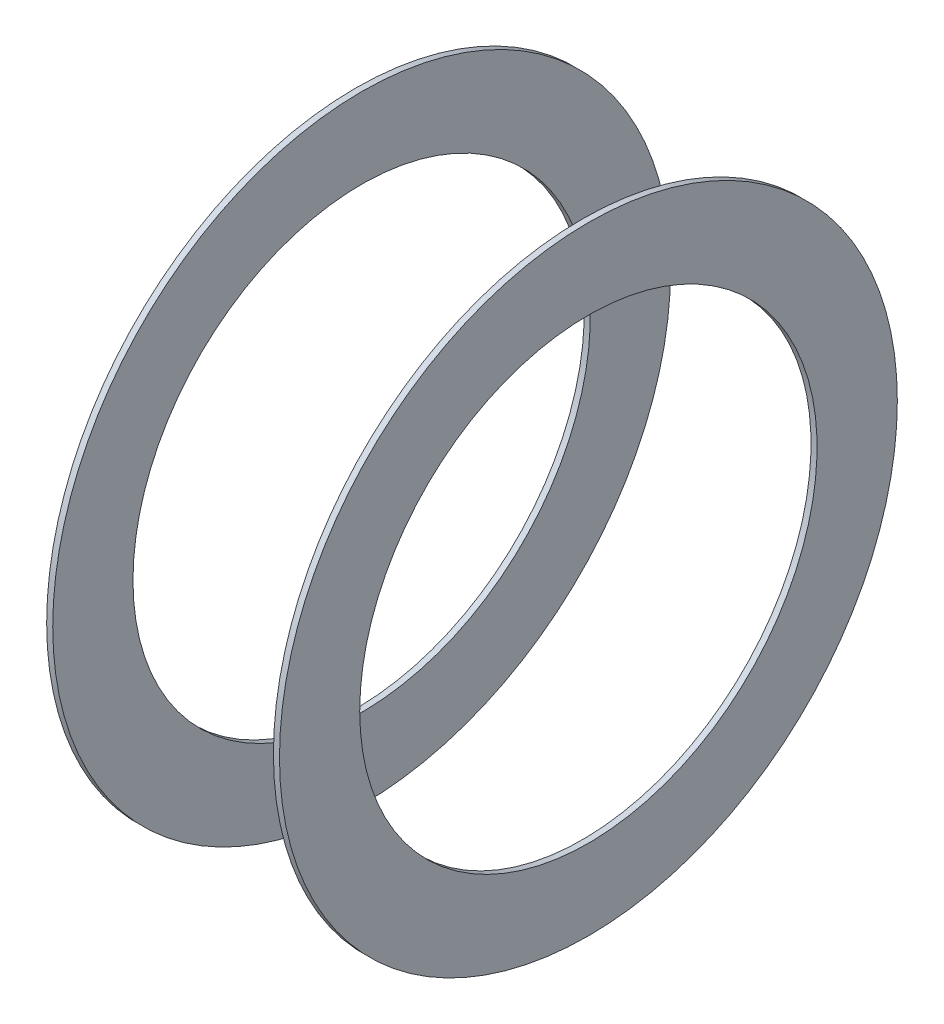
ISO-10303-21;
HEADER;
FILE_DESCRIPTION(('STEP AP214'),'2;1');
FILE_NAME('part.step','',(''),(''),'','','');
FILE_SCHEMA(('AUTOMOTIVE_DESIGN { 1 0 10303 214 1 1 1 1 }'));
ENDSEC;
DATA;
#1=APPLICATION_CONTEXT('core data for automotive mechanical design processes');
#2=APPLICATION_PROTOCOL_DEFINITION('international standard','automotive_design',2000,#1);
#3=PRODUCT_CONTEXT('',#1,'mechanical');
#4=PRODUCT('Part','Part','',(#3));
#5=PRODUCT_RELATED_PRODUCT_CATEGORY('part','',(#4));
#6=PRODUCT_DEFINITION_FORMATION('','',#4);
#7=PRODUCT_DEFINITION_CONTEXT('part definition',#1,'design');
#8=PRODUCT_DEFINITION('design','',#6,#7);
#9=PRODUCT_DEFINITION_SHAPE('','',#8);
#10=(LENGTH_UNIT() NAMED_UNIT(*) SI_UNIT(.MILLI.,.METRE.));
#11=(NAMED_UNIT(*) PLANE_ANGLE_UNIT() SI_UNIT($,.RADIAN.));
#12=(NAMED_UNIT(*) SI_UNIT($,.STERADIAN.) SOLID_ANGLE_UNIT());
#13=UNCERTAINTY_MEASURE_WITH_UNIT(LENGTH_MEASURE(1.E-05),#10,'distance_accuracy_value','');
#14=(GEOMETRIC_REPRESENTATION_CONTEXT(3) GLOBAL_UNCERTAINTY_ASSIGNED_CONTEXT((#13)) GLOBAL_UNIT_ASSIGNED_CONTEXT((#10,
#11,#12)) REPRESENTATION_CONTEXT('',''));
#15=CARTESIAN_POINT('',(0.,0.,0.));
#16=DIRECTION('',(0.,0.,1.));
#17=DIRECTION('',(1.,0.,0.));
#18=AXIS2_PLACEMENT_3D('',#15,#16,#17);
#19=CARTESIAN_POINT('',(10.7455746104761,0.,0.));
#20=DIRECTION('',(-1.,0.,0.));
#21=DIRECTION('',(0.,0.,1.));
#22=AXIS2_PLACEMENT_3D('',#19,#20,#21);
#23=CYLINDRICAL_SURFACE('',#22,6.51714543245679);
#24=CARTESIAN_POINT('',(18.9491618386922,0.,0.));
#25=DIRECTION('',(-1.,0.,0.));
#26=DIRECTION('',(0.,0.,1.));
#27=AXIS2_PLACEMENT_3D('',#24,#25,#26);
#28=CIRCLE('',#27,6.51714543245679);
#29=CARTESIAN_POINT('',(18.9491618386922,0.,6.51714543245679));
#30=VERTEX_POINT('',#29);
#31=EDGE_CURVE('E55',#30,#30,#28,.T.);
#32=ORIENTED_EDGE('',*,*,#31,.F.);
#33=EDGE_LOOP('',(#32));
#34=FACE_BOUND('',#33,.T.);
#35=CARTESIAN_POINT('',(18.7763639901825,0.,0.));
#36=DIRECTION('',(-1.,0.,0.));
#37=DIRECTION('',(0.,0.,1.));
#38=AXIS2_PLACEMENT_3D('',#35,#36,#37);
#39=CIRCLE('',#38,6.51714543245679);
#40=CARTESIAN_POINT('',(18.7763639901825,0.,6.51714543245679));
#41=VERTEX_POINT('',#40);
#42=EDGE_CURVE('E11',#41,#41,#39,.T.);
#43=ORIENTED_EDGE('',*,*,#42,.T.);
#44=EDGE_LOOP('',(#43));
#45=FACE_BOUND('',#44,.T.);
#46=ADVANCED_FACE('F41',(#34,#45),#23,.F.);
#47=CARTESIAN_POINT('',(18.7763639901825,6.51714543245679,0.));
#48=DIRECTION('',(1.,0.,0.));
#49=DIRECTION('',(0.,0.,-1.));
#50=AXIS2_PLACEMENT_3D('',#47,#48,#49);
#51=PLANE('',#50);
#52=ORIENTED_EDGE('',*,*,#42,.F.);
#53=EDGE_LOOP('',(#52));
#54=FACE_BOUND('',#53,.T.);
#55=CARTESIAN_POINT('',(18.7763639901825,0.,0.));
#56=DIRECTION('',(-1.,0.,0.));
#57=DIRECTION('',(0.,0.,1.));
#58=AXIS2_PLACEMENT_3D('',#55,#56,#57);
#59=CIRCLE('',#58,8.80403990897219);
#60=CARTESIAN_POINT('',(18.7763639901825,0.,8.80403990897219));
#61=VERTEX_POINT('',#60);
#62=EDGE_CURVE('E47',#61,#61,#59,.T.);
#63=ORIENTED_EDGE('',*,*,#62,.T.);
#64=EDGE_LOOP('',(#63));
#65=FACE_BOUND('',#64,.T.);
#66=ADVANCED_FACE('F64',(#54,#65),#51,.F.);
#67=CARTESIAN_POINT('',(10.7455746104761,0.,0.));
#68=DIRECTION('',(-1.,0.,0.));
#69=DIRECTION('',(0.,0.,1.));
#70=AXIS2_PLACEMENT_3D('',#67,#68,#69);
#71=CYLINDRICAL_SURFACE('',#70,8.80403990897219);
#72=ORIENTED_EDGE('',*,*,#62,.F.);
#73=EDGE_LOOP('',(#72));
#74=FACE_BOUND('',#73,.T.);
#75=CARTESIAN_POINT('',(18.9491618386922,0.,0.));
#76=DIRECTION('',(-1.,0.,0.));
#77=DIRECTION('',(0.,0.,1.));
#78=AXIS2_PLACEMENT_3D('',#75,#76,#77);
#79=CIRCLE('',#78,8.80403990897219);
#80=CARTESIAN_POINT('',(18.9491618386922,0.,8.80403990897219));
#81=VERTEX_POINT('',#80);
#82=EDGE_CURVE('E51',#81,#81,#79,.T.);
#83=ORIENTED_EDGE('',*,*,#82,.T.);
#84=EDGE_LOOP('',(#83));
#85=FACE_BOUND('',#84,.T.);
#86=ADVANCED_FACE('F68',(#74,#85),#71,.T.);
#87=CARTESIAN_POINT('',(18.9491618386922,6.51714543245679,0.));
#88=DIRECTION('',(-1.,0.,0.));
#89=DIRECTION('',(0.,0.,1.));
#90=AXIS2_PLACEMENT_3D('',#87,#88,#89);
#91=PLANE('',#90);
#92=ORIENTED_EDGE('',*,*,#82,.F.);
#93=EDGE_LOOP('',(#92));
#94=FACE_BOUND('',#93,.T.);
#95=ORIENTED_EDGE('',*,*,#31,.T.);
#96=EDGE_LOOP('',(#95));
#97=FACE_BOUND('',#96,.T.);
#98=ADVANCED_FACE('F61',(#94,#97),#91,.F.);
#99=CLOSED_SHELL('',(#46,#66,#86,#98));
#100=MANIFOLD_SOLID_BREP('B2',#99);
#101=CARTESIAN_POINT('',(12.3146879348327,6.51714543245679,0.));
#102=DIRECTION('',(1.,0.,0.));
#103=DIRECTION('',(0.,0.,-1.));
#104=AXIS2_PLACEMENT_3D('',#101,#102,#103);
#105=PLANE('',#104);
#106=CARTESIAN_POINT('',(12.3146879348327,0.,0.));
#107=DIRECTION('',(-1.,0.,0.));
#108=DIRECTION('',(0.,0.,1.));
#109=AXIS2_PLACEMENT_3D('',#106,#107,#108);
#110=CIRCLE('',#109,6.51714543245679);
#111=CARTESIAN_POINT('',(12.3146879348327,0.,6.51714543245679));
#112=VERTEX_POINT('',#111);
#113=EDGE_CURVE('E117',#112,#112,#110,.T.);
#114=ORIENTED_EDGE('',*,*,#113,.F.);
#115=EDGE_LOOP('',(#114));
#116=FACE_BOUND('',#115,.T.);
#117=CARTESIAN_POINT('',(12.3146879348327,0.,0.));
#118=DIRECTION('',(-1.,0.,0.));
#119=DIRECTION('',(0.,0.,1.));
#120=AXIS2_PLACEMENT_3D('',#117,#118,#119);
#121=CIRCLE('',#120,8.80403990897219);
#122=CARTESIAN_POINT('',(12.3146879348327,0.,8.80403990897219));
#123=VERTEX_POINT('',#122);
#124=EDGE_CURVE('E40',#123,#123,#121,.T.);
#125=ORIENTED_EDGE('',*,*,#124,.T.);
#126=EDGE_LOOP('',(#125));
#127=FACE_BOUND('',#126,.T.);
#128=ADVANCED_FACE('F103',(#116,#127),#105,.F.);
#129=CARTESIAN_POINT('',(10.7455746104761,0.,0.));
#130=DIRECTION('',(-1.,0.,0.));
#131=DIRECTION('',(0.,0.,1.));
#132=AXIS2_PLACEMENT_3D('',#129,#130,#131);
#133=CYLINDRICAL_SURFACE('',#132,8.80403990897219);
#134=ORIENTED_EDGE('',*,*,#124,.F.);
#135=EDGE_LOOP('',(#134));
#136=FACE_BOUND('',#135,.T.);
#137=CARTESIAN_POINT('',(12.4874857833424,0.,0.));
#138=DIRECTION('',(-1.,0.,0.));
#139=DIRECTION('',(0.,0.,1.));
#140=AXIS2_PLACEMENT_3D('',#137,#138,#139);
#141=CIRCLE('',#140,8.80403990897219);
#142=CARTESIAN_POINT('',(12.4874857833424,0.,8.80403990897219));
#143=VERTEX_POINT('',#142);
#144=EDGE_CURVE('E109',#143,#143,#141,.T.);
#145=ORIENTED_EDGE('',*,*,#144,.T.);
#146=EDGE_LOOP('',(#145));
#147=FACE_BOUND('',#146,.T.);
#148=ADVANCED_FACE('F126',(#136,#147),#133,.T.);
#149=CARTESIAN_POINT('',(12.4874857833424,6.51714543245679,0.));
#150=DIRECTION('',(-1.,0.,0.));
#151=DIRECTION('',(0.,0.,1.));
#152=AXIS2_PLACEMENT_3D('',#149,#150,#151);
#153=PLANE('',#152);
#154=ORIENTED_EDGE('',*,*,#144,.F.);
#155=EDGE_LOOP('',(#154));
#156=FACE_BOUND('',#155,.T.);
#157=CARTESIAN_POINT('',(12.4874857833424,0.,0.));
#158=DIRECTION('',(-1.,0.,0.));
#159=DIRECTION('',(0.,0.,1.));
#160=AXIS2_PLACEMENT_3D('',#157,#158,#159);
#161=CIRCLE('',#160,6.51714543245679);
#162=CARTESIAN_POINT('',(12.4874857833424,0.,6.51714543245679));
#163=VERTEX_POINT('',#162);
#164=EDGE_CURVE('E113',#163,#163,#161,.T.);
#165=ORIENTED_EDGE('',*,*,#164,.T.);
#166=EDGE_LOOP('',(#165));
#167=FACE_BOUND('',#166,.T.);
#168=ADVANCED_FACE('F130',(#156,#167),#153,.F.);
#169=CARTESIAN_POINT('',(10.7455746104761,0.,0.));
#170=DIRECTION('',(-1.,0.,0.));
#171=DIRECTION('',(0.,0.,1.));
#172=AXIS2_PLACEMENT_3D('',#169,#170,#171);
#173=CYLINDRICAL_SURFACE('',#172,6.51714543245679);
#174=ORIENTED_EDGE('',*,*,#164,.F.);
#175=EDGE_LOOP('',(#174));
#176=FACE_BOUND('',#175,.T.);
#177=ORIENTED_EDGE('',*,*,#113,.T.);
#178=EDGE_LOOP('',(#177));
#179=FACE_BOUND('',#178,.T.);
#180=ADVANCED_FACE('F123',(#176,#179),#173,.F.);
#181=CLOSED_SHELL('',(#128,#148,#168,#180));
#182=MANIFOLD_SOLID_BREP('B6',#181);
#183=ADVANCED_BREP_SHAPE_REPRESENTATION('',(#18,#100,#182),#14);
#184=SHAPE_DEFINITION_REPRESENTATION(#9,#183);
ENDSEC;
END-ISO-10303-21;
